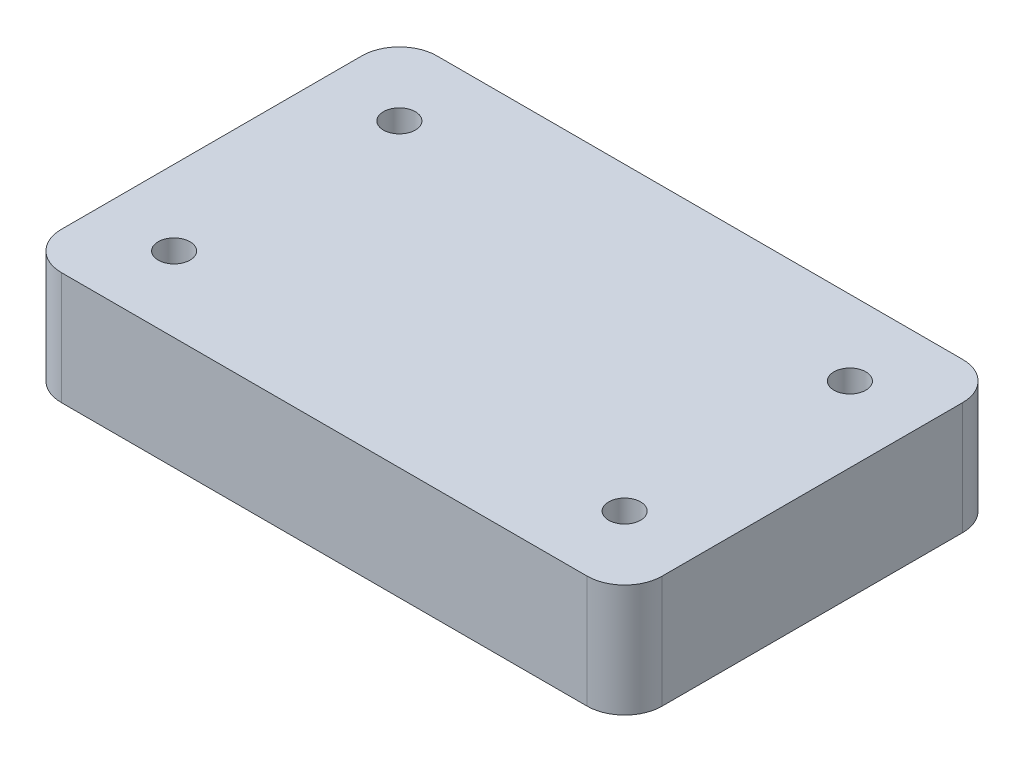
ISO-10303-21;
HEADER;
FILE_DESCRIPTION(('STEP AP214'),'2;1');
FILE_NAME('part.step','',(''),(''),'','','');
FILE_SCHEMA(('AUTOMOTIVE_DESIGN { 1 0 10303 214 1 1 1 1 }'));
ENDSEC;
DATA;
#1=APPLICATION_CONTEXT('core data for automotive mechanical design processes');
#2=APPLICATION_PROTOCOL_DEFINITION('international standard','automotive_design',2000,#1);
#3=PRODUCT_CONTEXT('',#1,'mechanical');
#4=PRODUCT('Part','Part','',(#3));
#5=PRODUCT_RELATED_PRODUCT_CATEGORY('part','',(#4));
#6=PRODUCT_DEFINITION_FORMATION('','',#4);
#7=PRODUCT_DEFINITION_CONTEXT('part definition',#1,'design');
#8=PRODUCT_DEFINITION('design','',#6,#7);
#9=PRODUCT_DEFINITION_SHAPE('','',#8);
#10=(LENGTH_UNIT() NAMED_UNIT(*) SI_UNIT(.MILLI.,.METRE.));
#11=(NAMED_UNIT(*) PLANE_ANGLE_UNIT() SI_UNIT($,.RADIAN.));
#12=(NAMED_UNIT(*) SI_UNIT($,.STERADIAN.) SOLID_ANGLE_UNIT());
#13=UNCERTAINTY_MEASURE_WITH_UNIT(LENGTH_MEASURE(1.E-05),#10,'distance_accuracy_value','');
#14=(GEOMETRIC_REPRESENTATION_CONTEXT(3) GLOBAL_UNCERTAINTY_ASSIGNED_CONTEXT((#13)) GLOBAL_UNIT_ASSIGNED_CONTEXT((#10,
#11,#12)) REPRESENTATION_CONTEXT('',''));
#15=CARTESIAN_POINT('',(0.,0.,0.));
#16=DIRECTION('',(0.,0.,1.));
#17=DIRECTION('',(1.,0.,0.));
#18=AXIS2_PLACEMENT_3D('',#15,#16,#17);
#19=CARTESIAN_POINT('',(-70.,30.,-40.));
#20=DIRECTION('',(0.,-1.,0.));
#21=DIRECTION('',(0.,0.,-1.));
#22=AXIS2_PLACEMENT_3D('',#19,#20,#21);
#23=CYLINDRICAL_SURFACE('',#22,10.);
#24=CARTESIAN_POINT('',(-70.,0.,-40.));
#25=DIRECTION('',(0.,1.,0.));
#26=DIRECTION('',(0.,0.,-1.));
#27=AXIS2_PLACEMENT_3D('',#24,#25,#26);
#28=CIRCLE('',#27,10.);
#29=CARTESIAN_POINT('',(-69.9999999999999,0.,-50.));
#30=VERTEX_POINT('',#29);
#31=CARTESIAN_POINT('',(-80.,0.,-39.9999999999999));
#32=VERTEX_POINT('',#31);
#33=EDGE_CURVE('E132',#30,#32,#28,.T.);
#34=ORIENTED_EDGE('',*,*,#33,.T.);
#35=DIRECTION('',(0.,-1.,0.));
#36=VECTOR('',#35,1.);
#37=CARTESIAN_POINT('',(-80.,30.,-39.9999999999999));
#38=LINE('',#37,#36);
#39=CARTESIAN_POINT('',(-80.,30.,-39.9999999999999));
#40=VERTEX_POINT('',#39);
#41=EDGE_CURVE('E11',#40,#32,#38,.T.);
#42=ORIENTED_EDGE('',*,*,#41,.F.);
#43=CARTESIAN_POINT('',(-70.,30.,-40.));
#44=DIRECTION('',(0.,1.,0.));
#45=DIRECTION('',(0.,0.,-1.));
#46=AXIS2_PLACEMENT_3D('',#43,#44,#45);
#47=CIRCLE('',#46,10.);
#48=CARTESIAN_POINT('',(-69.9999999999999,30.,-50.));
#49=VERTEX_POINT('',#48);
#50=EDGE_CURVE('E147',#49,#40,#47,.T.);
#51=ORIENTED_EDGE('',*,*,#50,.F.);
#52=DIRECTION('',(0.,-1.,0.));
#53=VECTOR('',#52,1.);
#54=CARTESIAN_POINT('',(-69.9999999999999,30.,-50.));
#55=LINE('',#54,#53);
#56=EDGE_CURVE('E128',#49,#30,#55,.T.);
#57=ORIENTED_EDGE('',*,*,#56,.T.);
#58=EDGE_LOOP('',(#34,#42,#51,#57));
#59=FACE_BOUND('',#58,.T.);
#60=ADVANCED_FACE('F36',(#59),#23,.T.);
#61=CARTESIAN_POINT('',(-80.,30.,39.9999999999999));
#62=DIRECTION('',(1.,0.,0.));
#63=DIRECTION('',(0.,0.,-1.));
#64=AXIS2_PLACEMENT_3D('',#61,#62,#63);
#65=PLANE('',#64);
#66=DIRECTION('',(0.,0.,1.));
#67=VECTOR('',#66,1.);
#68=CARTESIAN_POINT('',(-80.,0.,39.9999999999999));
#69=LINE('',#68,#67);
#70=CARTESIAN_POINT('',(-80.,0.,39.9999999999999));
#71=VERTEX_POINT('',#70);
#72=EDGE_CURVE('E135',#32,#71,#69,.T.);
#73=ORIENTED_EDGE('',*,*,#72,.T.);
#74=DIRECTION('',(0.,-1.,0.));
#75=VECTOR('',#74,1.);
#76=CARTESIAN_POINT('',(-80.,30.,39.9999999999999));
#77=LINE('',#76,#75);
#78=CARTESIAN_POINT('',(-80.,30.,39.9999999999999));
#79=VERTEX_POINT('',#78);
#80=EDGE_CURVE('E44',#79,#71,#77,.T.);
#81=ORIENTED_EDGE('',*,*,#80,.F.);
#82=DIRECTION('',(0.,0.,1.));
#83=VECTOR('',#82,1.);
#84=CARTESIAN_POINT('',(-80.,30.,39.9999999999999));
#85=LINE('',#84,#83);
#86=EDGE_CURVE('E95',#40,#79,#85,.T.);
#87=ORIENTED_EDGE('',*,*,#86,.F.);
#88=ORIENTED_EDGE('',*,*,#41,.T.);
#89=EDGE_LOOP('',(#73,#81,#87,#88));
#90=FACE_BOUND('',#89,.T.);
#91=ADVANCED_FACE('F233',(#90),#65,.F.);
#92=CARTESIAN_POINT('',(-70.,30.,40.));
#93=DIRECTION('',(0.,-1.,0.));
#94=DIRECTION('',(0.,0.,-1.));
#95=AXIS2_PLACEMENT_3D('',#92,#93,#94);
#96=CYLINDRICAL_SURFACE('',#95,10.);
#97=CARTESIAN_POINT('',(-70.,0.,40.));
#98=DIRECTION('',(0.,1.,0.));
#99=DIRECTION('',(0.,0.,-1.));
#100=AXIS2_PLACEMENT_3D('',#97,#98,#99);
#101=CIRCLE('',#100,10.);
#102=CARTESIAN_POINT('',(-69.9999999999999,0.,50.));
#103=VERTEX_POINT('',#102);
#104=EDGE_CURVE('E138',#71,#103,#101,.T.);
#105=ORIENTED_EDGE('',*,*,#104,.T.);
#106=DIRECTION('',(0.,-1.,0.));
#107=VECTOR('',#106,1.);
#108=CARTESIAN_POINT('',(-69.9999999999999,30.,50.));
#109=LINE('',#108,#107);
#110=CARTESIAN_POINT('',(-69.9999999999999,30.,50.));
#111=VERTEX_POINT('',#110);
#112=EDGE_CURVE('E154',#111,#103,#109,.T.);
#113=ORIENTED_EDGE('',*,*,#112,.F.);
#114=CARTESIAN_POINT('',(-70.,30.,40.));
#115=DIRECTION('',(0.,1.,0.));
#116=DIRECTION('',(0.,0.,-1.));
#117=AXIS2_PLACEMENT_3D('',#114,#115,#116);
#118=CIRCLE('',#117,10.);
#119=EDGE_CURVE('E162',#79,#111,#118,.T.);
#120=ORIENTED_EDGE('',*,*,#119,.F.);
#121=ORIENTED_EDGE('',*,*,#80,.T.);
#122=EDGE_LOOP('',(#105,#113,#120,#121));
#123=FACE_BOUND('',#122,.T.);
#124=ADVANCED_FACE('F160',(#123),#96,.T.);
#125=CARTESIAN_POINT('',(-69.9999999999999,30.,50.));
#126=DIRECTION('',(0.,0.,-1.));
#127=DIRECTION('',(-1.,0.,0.));
#128=AXIS2_PLACEMENT_3D('',#125,#126,#127);
#129=PLANE('',#128);
#130=DIRECTION('',(1.,0.,0.));
#131=VECTOR('',#130,1.);
#132=CARTESIAN_POINT('',(-69.9999999999999,0.,50.));
#133=LINE('',#132,#131);
#134=CARTESIAN_POINT('',(70.,0.,50.));
#135=VERTEX_POINT('',#134);
#136=EDGE_CURVE('E140',#103,#135,#133,.T.);
#137=ORIENTED_EDGE('',*,*,#136,.T.);
#138=DIRECTION('',(0.,-1.,0.));
#139=VECTOR('',#138,1.);
#140=CARTESIAN_POINT('',(70.,30.,50.));
#141=LINE('',#140,#139);
#142=CARTESIAN_POINT('',(70.,30.,50.));
#143=VERTEX_POINT('',#142);
#144=EDGE_CURVE('E151',#143,#135,#141,.T.);
#145=ORIENTED_EDGE('',*,*,#144,.F.);
#146=DIRECTION('',(1.,0.,0.));
#147=VECTOR('',#146,1.);
#148=CARTESIAN_POINT('',(-69.9999999999999,30.,50.));
#149=LINE('',#148,#147);
#150=EDGE_CURVE('E174',#111,#143,#149,.T.);
#151=ORIENTED_EDGE('',*,*,#150,.F.);
#152=ORIENTED_EDGE('',*,*,#112,.T.);
#153=EDGE_LOOP('',(#137,#145,#151,#152));
#154=FACE_BOUND('',#153,.T.);
#155=ADVANCED_FACE('F170',(#154),#129,.F.);
#156=CARTESIAN_POINT('',(70.,30.,40.));
#157=DIRECTION('',(0.,-1.,0.));
#158=DIRECTION('',(0.,0.,-1.));
#159=AXIS2_PLACEMENT_3D('',#156,#157,#158);
#160=CYLINDRICAL_SURFACE('',#159,10.);
#161=CARTESIAN_POINT('',(70.,0.,40.));
#162=DIRECTION('',(0.,1.,0.));
#163=DIRECTION('',(0.,0.,1.));
#164=AXIS2_PLACEMENT_3D('',#161,#162,#163);
#165=CIRCLE('',#164,10.);
#166=CARTESIAN_POINT('',(80.,0.,39.9999999999999));
#167=VERTEX_POINT('',#166);
#168=EDGE_CURVE('E142',#135,#167,#165,.T.);
#169=ORIENTED_EDGE('',*,*,#168,.T.);
#170=DIRECTION('',(0.,-1.,0.));
#171=VECTOR('',#170,1.);
#172=CARTESIAN_POINT('',(80.,30.,39.9999999999999));
#173=LINE('',#172,#171);
#174=CARTESIAN_POINT('',(80.,30.,39.9999999999999));
#175=VERTEX_POINT('',#174);
#176=EDGE_CURVE('E123',#175,#167,#173,.T.);
#177=ORIENTED_EDGE('',*,*,#176,.F.);
#178=CARTESIAN_POINT('',(70.,30.,40.));
#179=DIRECTION('',(0.,1.,0.));
#180=DIRECTION('',(0.,0.,1.));
#181=AXIS2_PLACEMENT_3D('',#178,#179,#180);
#182=CIRCLE('',#181,10.);
#183=EDGE_CURVE('E114',#143,#175,#182,.T.);
#184=ORIENTED_EDGE('',*,*,#183,.F.);
#185=ORIENTED_EDGE('',*,*,#144,.T.);
#186=EDGE_LOOP('',(#169,#177,#184,#185));
#187=FACE_BOUND('',#186,.T.);
#188=ADVANCED_FACE('F173',(#187),#160,.T.);
#189=CARTESIAN_POINT('',(80.,30.,39.9999999999999));
#190=DIRECTION('',(-1.,0.,0.));
#191=DIRECTION('',(0.,0.,1.));
#192=AXIS2_PLACEMENT_3D('',#189,#190,#191);
#193=PLANE('',#192);
#194=DIRECTION('',(0.,0.,-1.));
#195=VECTOR('',#194,1.);
#196=CARTESIAN_POINT('',(80.,0.,39.9999999999999));
#197=LINE('',#196,#195);
#198=CARTESIAN_POINT('',(80.,0.,-39.9999999999999));
#199=VERTEX_POINT('',#198);
#200=EDGE_CURVE('E122',#167,#199,#197,.T.);
#201=ORIENTED_EDGE('',*,*,#200,.T.);
#202=DIRECTION('',(0.,-1.,0.));
#203=VECTOR('',#202,1.);
#204=CARTESIAN_POINT('',(80.,30.,-39.9999999999999));
#205=LINE('',#204,#203);
#206=CARTESIAN_POINT('',(80.,30.,-39.9999999999999));
#207=VERTEX_POINT('',#206);
#208=EDGE_CURVE('E119',#207,#199,#205,.T.);
#209=ORIENTED_EDGE('',*,*,#208,.F.);
#210=DIRECTION('',(0.,0.,-1.));
#211=VECTOR('',#210,1.);
#212=CARTESIAN_POINT('',(80.,30.,39.9999999999999));
#213=LINE('',#212,#211);
#214=EDGE_CURVE('E108',#175,#207,#213,.T.);
#215=ORIENTED_EDGE('',*,*,#214,.F.);
#216=ORIENTED_EDGE('',*,*,#176,.T.);
#217=EDGE_LOOP('',(#201,#209,#215,#216));
#218=FACE_BOUND('',#217,.T.);
#219=ADVANCED_FACE('F120',(#218),#193,.F.);
#220=CARTESIAN_POINT('',(70.,30.,-40.));
#221=DIRECTION('',(0.,-1.,0.));
#222=DIRECTION('',(0.,0.,-1.));
#223=AXIS2_PLACEMENT_3D('',#220,#221,#222);
#224=CYLINDRICAL_SURFACE('',#223,10.);
#225=CARTESIAN_POINT('',(70.,0.,-40.));
#226=DIRECTION('',(0.,1.,0.));
#227=DIRECTION('',(0.,0.,-1.));
#228=AXIS2_PLACEMENT_3D('',#225,#226,#227);
#229=CIRCLE('',#228,10.);
#230=CARTESIAN_POINT('',(70.,0.,-50.));
#231=VERTEX_POINT('',#230);
#232=EDGE_CURVE('E81',#199,#231,#229,.T.);
#233=ORIENTED_EDGE('',*,*,#232,.T.);
#234=DIRECTION('',(0.,-1.,0.));
#235=VECTOR('',#234,1.);
#236=CARTESIAN_POINT('',(70.,30.,-50.));
#237=LINE('',#236,#235);
#238=CARTESIAN_POINT('',(70.,30.,-50.));
#239=VERTEX_POINT('',#238);
#240=EDGE_CURVE('E124',#239,#231,#237,.T.);
#241=ORIENTED_EDGE('',*,*,#240,.F.);
#242=CARTESIAN_POINT('',(70.,30.,-40.));
#243=DIRECTION('',(0.,1.,0.));
#244=DIRECTION('',(0.,0.,-1.));
#245=AXIS2_PLACEMENT_3D('',#242,#243,#244);
#246=CIRCLE('',#245,10.);
#247=EDGE_CURVE('E112',#207,#239,#246,.T.);
#248=ORIENTED_EDGE('',*,*,#247,.F.);
#249=ORIENTED_EDGE('',*,*,#208,.T.);
#250=EDGE_LOOP('',(#233,#241,#248,#249));
#251=FACE_BOUND('',#250,.T.);
#252=ADVANCED_FACE('F126',(#251),#224,.T.);
#253=CARTESIAN_POINT('',(-69.9999999999999,30.,-50.));
#254=DIRECTION('',(0.,0.,1.));
#255=DIRECTION('',(1.,0.,0.));
#256=AXIS2_PLACEMENT_3D('',#253,#254,#255);
#257=PLANE('',#256);
#258=DIRECTION('',(-1.,0.,0.));
#259=VECTOR('',#258,1.);
#260=CARTESIAN_POINT('',(-69.9999999999999,0.,-50.));
#261=LINE('',#260,#259);
#262=EDGE_CURVE('E87',#231,#30,#261,.T.);
#263=ORIENTED_EDGE('',*,*,#262,.T.);
#264=ORIENTED_EDGE('',*,*,#56,.F.);
#265=DIRECTION('',(-1.,0.,0.));
#266=VECTOR('',#265,1.);
#267=CARTESIAN_POINT('',(-69.9999999999999,30.,-50.));
#268=LINE('',#267,#266);
#269=EDGE_CURVE('E52',#239,#49,#268,.T.);
#270=ORIENTED_EDGE('',*,*,#269,.F.);
#271=ORIENTED_EDGE('',*,*,#240,.T.);
#272=EDGE_LOOP('',(#263,#264,#270,#271));
#273=FACE_BOUND('',#272,.T.);
#274=ADVANCED_FACE('F208',(#273),#257,.F.);
#275=CARTESIAN_POINT('',(-70.,30.,-40.));
#276=DIRECTION('',(0.,-1.,0.));
#277=DIRECTION('',(0.,0.,-1.));
#278=AXIS2_PLACEMENT_3D('',#275,#276,#277);
#279=PLANE('',#278);
#280=CARTESIAN_POINT('',(-60.,30.,-30.));
#281=DIRECTION('',(0.,1.,0.));
#282=DIRECTION('',(0.,0.,1.));
#283=AXIS2_PLACEMENT_3D('',#280,#281,#282);
#284=CIRCLE('',#283,4.25);
#285=CARTESIAN_POINT('',(-60.,30.,-25.75));
#286=VERTEX_POINT('',#285);
#287=EDGE_CURVE('E200',#286,#286,#284,.T.);
#288=ORIENTED_EDGE('',*,*,#287,.F.);
#289=EDGE_LOOP('',(#288));
#290=FACE_BOUND('',#289,.T.);
#291=CARTESIAN_POINT('',(60.,30.,-30.));
#292=DIRECTION('',(0.,1.,0.));
#293=DIRECTION('',(0.,0.,1.));
#294=AXIS2_PLACEMENT_3D('',#291,#292,#293);
#295=CIRCLE('',#294,4.24999999999999);
#296=CARTESIAN_POINT('',(60.,30.,-25.75));
#297=VERTEX_POINT('',#296);
#298=EDGE_CURVE('E194',#297,#297,#295,.T.);
#299=ORIENTED_EDGE('',*,*,#298,.F.);
#300=EDGE_LOOP('',(#299));
#301=FACE_BOUND('',#300,.T.);
#302=CARTESIAN_POINT('',(60.,30.,30.));
#303=DIRECTION('',(0.,1.,0.));
#304=DIRECTION('',(0.,0.,1.));
#305=AXIS2_PLACEMENT_3D('',#302,#303,#304);
#306=CIRCLE('',#305,4.25);
#307=CARTESIAN_POINT('',(60.,30.,34.25));
#308=VERTEX_POINT('',#307);
#309=EDGE_CURVE('E188',#308,#308,#306,.T.);
#310=ORIENTED_EDGE('',*,*,#309,.F.);
#311=EDGE_LOOP('',(#310));
#312=FACE_BOUND('',#311,.T.);
#313=CARTESIAN_POINT('',(-60.,30.,30.));
#314=DIRECTION('',(0.,1.,0.));
#315=DIRECTION('',(0.,0.,1.));
#316=AXIS2_PLACEMENT_3D('',#313,#314,#315);
#317=CIRCLE('',#316,4.25);
#318=CARTESIAN_POINT('',(-60.,30.,34.25));
#319=VERTEX_POINT('',#318);
#320=EDGE_CURVE('E182',#319,#319,#317,.T.);
#321=ORIENTED_EDGE('',*,*,#320,.F.);
#322=EDGE_LOOP('',(#321));
#323=FACE_BOUND('',#322,.T.);
#324=ORIENTED_EDGE('',*,*,#50,.T.);
#325=ORIENTED_EDGE('',*,*,#86,.T.);
#326=ORIENTED_EDGE('',*,*,#119,.T.);
#327=ORIENTED_EDGE('',*,*,#150,.T.);
#328=ORIENTED_EDGE('',*,*,#183,.T.);
#329=ORIENTED_EDGE('',*,*,#214,.T.);
#330=ORIENTED_EDGE('',*,*,#247,.T.);
#331=ORIENTED_EDGE('',*,*,#269,.T.);
#332=EDGE_LOOP('',(#324,#325,#326,#327,#328,#329,#330,#331));
#333=FACE_BOUND('',#332,.T.);
#334=ADVANCED_FACE('F110',(#290,#301,#312,#323,#333),#279,.F.);
#335=CARTESIAN_POINT('',(-70.,0.,-40.));
#336=DIRECTION('',(0.,-1.,0.));
#337=DIRECTION('',(0.,0.,-1.));
#338=AXIS2_PLACEMENT_3D('',#335,#336,#337);
#339=PLANE('',#338);
#340=CARTESIAN_POINT('',(-60.,0.,-30.));
#341=DIRECTION('',(0.,1.,0.));
#342=DIRECTION('',(0.,0.,1.));
#343=AXIS2_PLACEMENT_3D('',#340,#341,#342);
#344=CIRCLE('',#343,4.24999999999999);
#345=CARTESIAN_POINT('',(-60.,0.,-25.75));
#346=VERTEX_POINT('',#345);
#347=EDGE_CURVE('E197',#346,#346,#344,.T.);
#348=ORIENTED_EDGE('',*,*,#347,.T.);
#349=EDGE_LOOP('',(#348));
#350=FACE_BOUND('',#349,.T.);
#351=CARTESIAN_POINT('',(60.,0.,-30.));
#352=DIRECTION('',(0.,1.,0.));
#353=DIRECTION('',(0.,0.,1.));
#354=AXIS2_PLACEMENT_3D('',#351,#352,#353);
#355=CIRCLE('',#354,4.24999999999999);
#356=CARTESIAN_POINT('',(60.,0.,-25.75));
#357=VERTEX_POINT('',#356);
#358=EDGE_CURVE('E191',#357,#357,#355,.T.);
#359=ORIENTED_EDGE('',*,*,#358,.T.);
#360=EDGE_LOOP('',(#359));
#361=FACE_BOUND('',#360,.T.);
#362=CARTESIAN_POINT('',(60.,0.,30.));
#363=DIRECTION('',(0.,1.,0.));
#364=DIRECTION('',(0.,0.,1.));
#365=AXIS2_PLACEMENT_3D('',#362,#363,#364);
#366=CIRCLE('',#365,4.25);
#367=CARTESIAN_POINT('',(60.,0.,34.25));
#368=VERTEX_POINT('',#367);
#369=EDGE_CURVE('E185',#368,#368,#366,.T.);
#370=ORIENTED_EDGE('',*,*,#369,.T.);
#371=EDGE_LOOP('',(#370));
#372=FACE_BOUND('',#371,.T.);
#373=CARTESIAN_POINT('',(-60.,0.,30.));
#374=DIRECTION('',(0.,1.,0.));
#375=DIRECTION('',(0.,0.,1.));
#376=AXIS2_PLACEMENT_3D('',#373,#374,#375);
#377=CIRCLE('',#376,4.24999999999999);
#378=CARTESIAN_POINT('',(-60.,0.,34.25));
#379=VERTEX_POINT('',#378);
#380=EDGE_CURVE('E136',#379,#379,#377,.T.);
#381=ORIENTED_EDGE('',*,*,#380,.T.);
#382=EDGE_LOOP('',(#381));
#383=FACE_BOUND('',#382,.T.);
#384=ORIENTED_EDGE('',*,*,#33,.F.);
#385=ORIENTED_EDGE('',*,*,#262,.F.);
#386=ORIENTED_EDGE('',*,*,#232,.F.);
#387=ORIENTED_EDGE('',*,*,#200,.F.);
#388=ORIENTED_EDGE('',*,*,#168,.F.);
#389=ORIENTED_EDGE('',*,*,#136,.F.);
#390=ORIENTED_EDGE('',*,*,#104,.F.);
#391=ORIENTED_EDGE('',*,*,#72,.F.);
#392=EDGE_LOOP('',(#384,#385,#386,#387,#388,#389,#390,#391));
#393=FACE_BOUND('',#392,.T.);
#394=ADVANCED_FACE('F166',(#350,#361,#372,#383,#393),#339,.T.);
#395=CARTESIAN_POINT('',(-60.,30.,30.));
#396=DIRECTION('',(0.,1.,0.));
#397=DIRECTION('',(0.,0.,1.));
#398=AXIS2_PLACEMENT_3D('',#395,#396,#397);
#399=CYLINDRICAL_SURFACE('',#398,4.24999999999999);
#400=ORIENTED_EDGE('',*,*,#380,.F.);
#401=EDGE_LOOP('',(#400));
#402=FACE_BOUND('',#401,.T.);
#403=ORIENTED_EDGE('',*,*,#320,.T.);
#404=EDGE_LOOP('',(#403));
#405=FACE_BOUND('',#404,.T.);
#406=ADVANCED_FACE('F216',(#402,#405),#399,.F.);
#407=CARTESIAN_POINT('',(60.,30.,30.));
#408=DIRECTION('',(0.,1.,0.));
#409=DIRECTION('',(0.,0.,1.));
#410=AXIS2_PLACEMENT_3D('',#407,#408,#409);
#411=CYLINDRICAL_SURFACE('',#410,4.25);
#412=ORIENTED_EDGE('',*,*,#369,.F.);
#413=EDGE_LOOP('',(#412));
#414=FACE_BOUND('',#413,.T.);
#415=ORIENTED_EDGE('',*,*,#309,.T.);
#416=EDGE_LOOP('',(#415));
#417=FACE_BOUND('',#416,.T.);
#418=ADVANCED_FACE('F218',(#414,#417),#411,.F.);
#419=CARTESIAN_POINT('',(60.,30.,-30.));
#420=DIRECTION('',(0.,1.,0.));
#421=DIRECTION('',(0.,0.,1.));
#422=AXIS2_PLACEMENT_3D('',#419,#420,#421);
#423=CYLINDRICAL_SURFACE('',#422,4.24999999999999);
#424=ORIENTED_EDGE('',*,*,#358,.F.);
#425=EDGE_LOOP('',(#424));
#426=FACE_BOUND('',#425,.T.);
#427=ORIENTED_EDGE('',*,*,#298,.T.);
#428=EDGE_LOOP('',(#427));
#429=FACE_BOUND('',#428,.T.);
#430=ADVANCED_FACE('F225',(#426,#429),#423,.F.);
#431=CARTESIAN_POINT('',(-60.,30.,-30.));
#432=DIRECTION('',(0.,1.,0.));
#433=DIRECTION('',(0.,0.,1.));
#434=AXIS2_PLACEMENT_3D('',#431,#432,#433);
#435=CYLINDRICAL_SURFACE('',#434,4.24999999999999);
#436=ORIENTED_EDGE('',*,*,#347,.F.);
#437=EDGE_LOOP('',(#436));
#438=FACE_BOUND('',#437,.T.);
#439=ORIENTED_EDGE('',*,*,#287,.T.);
#440=EDGE_LOOP('',(#439));
#441=FACE_BOUND('',#440,.T.);
#442=ADVANCED_FACE('F204',(#438,#441),#435,.F.);
#443=CLOSED_SHELL('',(#60,#91,#124,#155,#188,#219,#252,#274,#334,#394,#406,#418,#430,#442));
#444=MANIFOLD_SOLID_BREP('B2',#443);
#445=ADVANCED_BREP_SHAPE_REPRESENTATION('',(#18,#444),#14);
#446=SHAPE_DEFINITION_REPRESENTATION(#9,#445);
ENDSEC;
END-ISO-10303-21;
